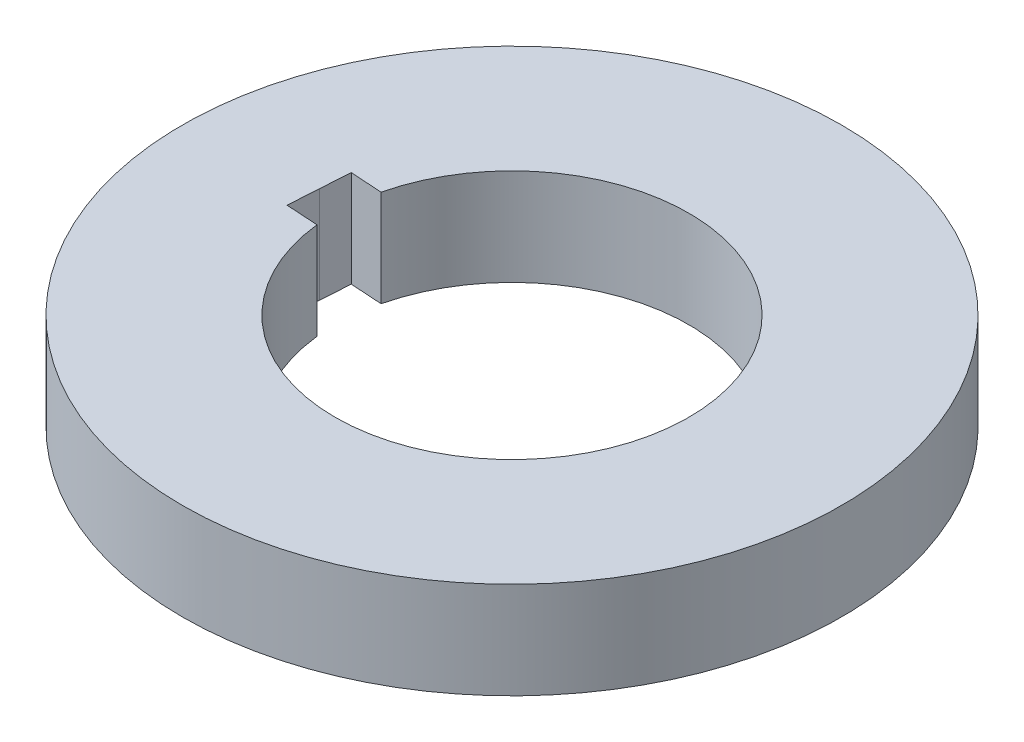
ISO-10303-21;
HEADER;
FILE_DESCRIPTION(('STEP AP214'),'2;1');
FILE_NAME('part.step','',(''),(''),'','','');
FILE_SCHEMA(('AUTOMOTIVE_DESIGN { 1 0 10303 214 1 1 1 1 }'));
ENDSEC;
DATA;
#1=APPLICATION_CONTEXT('core data for automotive mechanical design processes');
#2=APPLICATION_PROTOCOL_DEFINITION('international standard','automotive_design',2000,#1);
#3=PRODUCT_CONTEXT('',#1,'mechanical');
#4=PRODUCT('Part','Part','',(#3));
#5=PRODUCT_RELATED_PRODUCT_CATEGORY('part','',(#4));
#6=PRODUCT_DEFINITION_FORMATION('','',#4);
#7=PRODUCT_DEFINITION_CONTEXT('part definition',#1,'design');
#8=PRODUCT_DEFINITION('design','',#6,#7);
#9=PRODUCT_DEFINITION_SHAPE('','',#8);
#10=(LENGTH_UNIT() NAMED_UNIT(*) SI_UNIT(.MILLI.,.METRE.));
#11=(NAMED_UNIT(*) PLANE_ANGLE_UNIT() SI_UNIT($,.RADIAN.));
#12=(NAMED_UNIT(*) SI_UNIT($,.STERADIAN.) SOLID_ANGLE_UNIT());
#13=UNCERTAINTY_MEASURE_WITH_UNIT(LENGTH_MEASURE(1.E-05),#10,'distance_accuracy_value','');
#14=(GEOMETRIC_REPRESENTATION_CONTEXT(3) GLOBAL_UNCERTAINTY_ASSIGNED_CONTEXT((#13)) GLOBAL_UNIT_ASSIGNED_CONTEXT((#10,
#11,#12)) REPRESENTATION_CONTEXT('',''));
#15=CARTESIAN_POINT('',(0.,0.,0.));
#16=DIRECTION('',(0.,0.,1.));
#17=DIRECTION('',(1.,0.,0.));
#18=AXIS2_PLACEMENT_3D('',#15,#16,#17);
#19=CARTESIAN_POINT('',(0.,5.,0.));
#20=DIRECTION('',(0.,-1.,0.));
#21=DIRECTION('',(0.,0.,-1.));
#22=AXIS2_PLACEMENT_3D('',#19,#20,#21);
#23=CYLINDRICAL_SURFACE('',#22,17.05);
#24=CARTESIAN_POINT('',(0.,5.,0.));
#25=DIRECTION('',(0.,1.,0.));
#26=DIRECTION('',(0.,0.,1.));
#27=AXIS2_PLACEMENT_3D('',#24,#25,#26);
#28=CIRCLE('',#27,17.05);
#29=CARTESIAN_POINT('',(0.,5.,17.05));
#30=VERTEX_POINT('',#29);
#31=EDGE_CURVE('E11',#30,#30,#28,.T.);
#32=ORIENTED_EDGE('',*,*,#31,.F.);
#33=EDGE_LOOP('',(#32));
#34=FACE_BOUND('',#33,.T.);
#35=CARTESIAN_POINT('',(0.,0.,0.));
#36=DIRECTION('',(0.,1.,0.));
#37=DIRECTION('',(0.,0.,1.));
#38=AXIS2_PLACEMENT_3D('',#35,#36,#37);
#39=CIRCLE('',#38,17.05);
#40=CARTESIAN_POINT('',(0.,0.,17.05));
#41=VERTEX_POINT('',#40);
#42=EDGE_CURVE('E45',#41,#41,#39,.T.);
#43=ORIENTED_EDGE('',*,*,#42,.T.);
#44=EDGE_LOOP('',(#43));
#45=FACE_BOUND('',#44,.T.);
#46=ADVANCED_FACE('F42',(#34,#45),#23,.T.);
#47=CARTESIAN_POINT('',(0.,5.,0.));
#48=DIRECTION('',(0.,1.,0.));
#49=DIRECTION('',(0.,0.,1.));
#50=AXIS2_PLACEMENT_3D('',#47,#48,#49);
#51=PLANE('',#50);
#52=DIRECTION('',(-0.997935942740257,0.,-0.0642172421325776));
#53=VECTOR('',#52,1.);
#54=CARTESIAN_POINT('',(-10.548439783733,5.,-2.23199868480201));
#55=LINE('',#54,#53);
#56=CARTESIAN_POINT('',(-8.89961035525185,5.,-2.12589640497697));
#57=VERTEX_POINT('',#56);
#58=CARTESIAN_POINT('',(-10.548439783733,5.,-2.23199868480201));
#59=VERTEX_POINT('',#58);
#60=EDGE_CURVE('E129',#57,#59,#55,.T.);
#61=ORIENTED_EDGE('',*,*,#60,.F.);
#62=CARTESIAN_POINT('',(0.,5.,0.));
#63=DIRECTION('',(0.,1.,0.));
#64=DIRECTION('',(0.,0.,1.));
#65=AXIS2_PLACEMENT_3D('',#62,#63,#64);
#66=CIRCLE('',#65,9.15);
#67=CARTESIAN_POINT('',(-9.09587356863715,5.,0.993772621562903));
#68=VERTEX_POINT('',#67);
#69=EDGE_CURVE('E111',#68,#57,#66,.T.);
#70=ORIENTED_EDGE('',*,*,#69,.F.);
#71=DIRECTION('',(0.998026923397017,0.,0.0627874205130647));
#72=VECTOR('',#71,1.);
#73=CARTESIAN_POINT('',(-10.7470679499657,5.,0.889893423979336));
#74=LINE('',#73,#72);
#75=CARTESIAN_POINT('',(-10.7470679499657,5.,0.889893423979336));
#76=VERTEX_POINT('',#75);
#77=EDGE_CURVE('E56',#76,#68,#74,.T.);
#78=ORIENTED_EDGE('',*,*,#77,.F.);
#79=DIRECTION('',(-0.0627874205130644,0.,0.998026923397017));
#80=VECTOR('',#79,1.);
#81=CARTESIAN_POINT('',(-10.6479765090385,5.,-0.685197973554616));
#82=LINE('',#81,#80);
#83=CARTESIAN_POINT('',(-10.6479765090385,5.,-0.685197973554616));
#84=VERTEX_POINT('',#83);
#85=EDGE_CURVE('E132',#84,#76,#82,.T.);
#86=ORIENTED_EDGE('',*,*,#85,.F.);
#87=DIRECTION('',(-0.0642172421325776,0.,0.997935942740257));
#88=VECTOR('',#87,1.);
#89=CARTESIAN_POINT('',(-10.6479765090385,5.,-0.685197973554616));
#90=LINE('',#89,#88);
#91=EDGE_CURVE('E126',#59,#84,#90,.T.);
#92=ORIENTED_EDGE('',*,*,#91,.F.);
#93=EDGE_LOOP('',(#61,#70,#78,#86,#92));
#94=FACE_BOUND('',#93,.T.);
#95=ORIENTED_EDGE('',*,*,#31,.T.);
#96=EDGE_LOOP('',(#95));
#97=FACE_BOUND('',#96,.T.);
#98=ADVANCED_FACE('F149',(#94,#97),#51,.T.);
#99=CARTESIAN_POINT('',(0.,0.,0.));
#100=DIRECTION('',(0.,1.,0.));
#101=DIRECTION('',(0.,0.,1.));
#102=AXIS2_PLACEMENT_3D('',#99,#100,#101);
#103=PLANE('',#102);
#104=CARTESIAN_POINT('',(0.,0.,0.));
#105=DIRECTION('',(0.,1.,0.));
#106=DIRECTION('',(0.,0.,1.));
#107=AXIS2_PLACEMENT_3D('',#104,#105,#106);
#108=CIRCLE('',#107,9.15);
#109=CARTESIAN_POINT('',(-9.09587356863715,0.,0.993772621562908));
#110=VERTEX_POINT('',#109);
#111=CARTESIAN_POINT('',(-8.89961035525185,0.,-2.12589640497697));
#112=VERTEX_POINT('',#111);
#113=EDGE_CURVE('E109',#110,#112,#108,.T.);
#114=ORIENTED_EDGE('',*,*,#113,.T.);
#115=DIRECTION('',(-0.997935942740257,0.,-0.0642172421325776));
#116=VECTOR('',#115,1.);
#117=CARTESIAN_POINT('',(-10.548439783733,0.,-2.23199868480201));
#118=LINE('',#117,#116);
#119=CARTESIAN_POINT('',(-10.548439783733,0.,-2.23199868480201));
#120=VERTEX_POINT('',#119);
#121=EDGE_CURVE('E92',#112,#120,#118,.T.);
#122=ORIENTED_EDGE('',*,*,#121,.T.);
#123=DIRECTION('',(-0.0642172421325776,0.,0.997935942740257));
#124=VECTOR('',#123,1.);
#125=CARTESIAN_POINT('',(-10.6479765090385,0.,-0.685197973554616));
#126=LINE('',#125,#124);
#127=CARTESIAN_POINT('',(-10.6479765090385,0.,-0.685197973554616));
#128=VERTEX_POINT('',#127);
#129=EDGE_CURVE('E102',#120,#128,#126,.T.);
#130=ORIENTED_EDGE('',*,*,#129,.T.);
#131=DIRECTION('',(-0.0627874205130644,0.,0.998026923397017));
#132=VECTOR('',#131,1.);
#133=CARTESIAN_POINT('',(-10.6479765090385,0.,-0.685197973554616));
#134=LINE('',#133,#132);
#135=CARTESIAN_POINT('',(-10.7470679499657,0.,0.889893423979336));
#136=VERTEX_POINT('',#135);
#137=EDGE_CURVE('E128',#128,#136,#134,.T.);
#138=ORIENTED_EDGE('',*,*,#137,.T.);
#139=DIRECTION('',(0.998026923397017,0.,0.0627874205130647));
#140=VECTOR('',#139,1.);
#141=CARTESIAN_POINT('',(-10.7470679499657,0.,0.889893423979336));
#142=LINE('',#141,#140);
#143=EDGE_CURVE('E103',#136,#110,#142,.T.);
#144=ORIENTED_EDGE('',*,*,#143,.T.);
#145=EDGE_LOOP('',(#114,#122,#130,#138,#144));
#146=FACE_BOUND('',#145,.T.);
#147=ORIENTED_EDGE('',*,*,#42,.F.);
#148=EDGE_LOOP('',(#147));
#149=FACE_BOUND('',#148,.T.);
#150=ADVANCED_FACE('F115',(#146,#149),#103,.F.);
#151=CARTESIAN_POINT('',(0.,0.,0.));
#152=DIRECTION('',(0.,1.,0.));
#153=DIRECTION('',(0.,0.,1.));
#154=AXIS2_PLACEMENT_3D('',#151,#152,#153);
#155=CYLINDRICAL_SURFACE('',#154,9.15);
#156=ORIENTED_EDGE('',*,*,#69,.T.);
#157=DIRECTION('',(0.,1.,0.));
#158=VECTOR('',#157,1.);
#159=CARTESIAN_POINT('',(-8.89961035525185,0.,-2.12589640497697));
#160=LINE('',#159,#158);
#161=EDGE_CURVE('E96',#112,#57,#160,.T.);
#162=ORIENTED_EDGE('',*,*,#161,.F.);
#163=ORIENTED_EDGE('',*,*,#113,.F.);
#164=DIRECTION('',(0.,1.,0.));
#165=VECTOR('',#164,1.);
#166=CARTESIAN_POINT('',(-9.09587356863715,0.,0.993772621562908));
#167=LINE('',#166,#165);
#168=EDGE_CURVE('E112',#110,#68,#167,.T.);
#169=ORIENTED_EDGE('',*,*,#168,.T.);
#170=EDGE_LOOP('',(#156,#162,#163,#169));
#171=FACE_BOUND('',#170,.T.);
#172=ADVANCED_FACE('F108',(#171),#155,.F.);
#173=CARTESIAN_POINT('',(-10.6479765090385,0.,-0.685197973554616));
#174=DIRECTION('',(-0.998026923397017,0.,-0.0627874205130644));
#175=DIRECTION('',(-0.0627874205130644,0.,0.998026923397017));
#176=AXIS2_PLACEMENT_3D('',#173,#174,#175);
#177=PLANE('',#176);
#178=ORIENTED_EDGE('',*,*,#85,.T.);
#179=DIRECTION('',(0.,1.,0.));
#180=VECTOR('',#179,1.);
#181=CARTESIAN_POINT('',(-10.7470679499657,0.,0.889893423979336));
#182=LINE('',#181,#180);
#183=EDGE_CURVE('E86',#136,#76,#182,.T.);
#184=ORIENTED_EDGE('',*,*,#183,.F.);
#185=ORIENTED_EDGE('',*,*,#137,.F.);
#186=DIRECTION('',(0.,1.,0.));
#187=VECTOR('',#186,1.);
#188=CARTESIAN_POINT('',(-10.6479765090385,0.,-0.685197973554616));
#189=LINE('',#188,#187);
#190=EDGE_CURVE('E65',#128,#84,#189,.T.);
#191=ORIENTED_EDGE('',*,*,#190,.T.);
#192=EDGE_LOOP('',(#178,#184,#185,#191));
#193=FACE_BOUND('',#192,.T.);
#194=ADVANCED_FACE('F136',(#193),#177,.F.);
#195=CARTESIAN_POINT('',(-10.6479765090385,0.,-0.685197973554616));
#196=DIRECTION('',(-0.997935942740257,0.,-0.0642172421325776));
#197=DIRECTION('',(-0.0642172421325776,0.,0.997935942740257));
#198=AXIS2_PLACEMENT_3D('',#195,#196,#197);
#199=PLANE('',#198);
#200=ORIENTED_EDGE('',*,*,#91,.T.);
#201=ORIENTED_EDGE('',*,*,#190,.F.);
#202=ORIENTED_EDGE('',*,*,#129,.F.);
#203=DIRECTION('',(0.,1.,0.));
#204=VECTOR('',#203,1.);
#205=CARTESIAN_POINT('',(-10.548439783733,0.,-2.23199868480201));
#206=LINE('',#205,#204);
#207=EDGE_CURVE('E98',#120,#59,#206,.T.);
#208=ORIENTED_EDGE('',*,*,#207,.T.);
#209=EDGE_LOOP('',(#200,#201,#202,#208));
#210=FACE_BOUND('',#209,.T.);
#211=ADVANCED_FACE('F139',(#210),#199,.F.);
#212=CARTESIAN_POINT('',(-10.548439783733,0.,-2.23199868480201));
#213=DIRECTION('',(0.0642172421325776,0.,-0.997935942740257));
#214=DIRECTION('',(-0.997935942740257,0.,-0.0642172421325776));
#215=AXIS2_PLACEMENT_3D('',#212,#213,#214);
#216=PLANE('',#215);
#217=ORIENTED_EDGE('',*,*,#60,.T.);
#218=ORIENTED_EDGE('',*,*,#207,.F.);
#219=ORIENTED_EDGE('',*,*,#121,.F.);
#220=ORIENTED_EDGE('',*,*,#161,.T.);
#221=EDGE_LOOP('',(#217,#218,#219,#220));
#222=FACE_BOUND('',#221,.T.);
#223=ADVANCED_FACE('F95',(#222),#216,.F.);
#224=CARTESIAN_POINT('',(-10.7470679499657,0.,0.889893423979336));
#225=DIRECTION('',(-0.0627874205130647,0.,0.998026923397017));
#226=DIRECTION('',(0.998026923397017,0.,0.0627874205130647));
#227=AXIS2_PLACEMENT_3D('',#224,#225,#226);
#228=PLANE('',#227);
#229=ORIENTED_EDGE('',*,*,#77,.T.);
#230=ORIENTED_EDGE('',*,*,#168,.F.);
#231=ORIENTED_EDGE('',*,*,#143,.F.);
#232=ORIENTED_EDGE('',*,*,#183,.T.);
#233=EDGE_LOOP('',(#229,#230,#231,#232));
#234=FACE_BOUND('',#233,.T.);
#235=ADVANCED_FACE('F187',(#234),#228,.F.);
#236=CLOSED_SHELL('',(#46,#98,#150,#172,#194,#211,#223,#235));
#237=MANIFOLD_SOLID_BREP('B2',#236);
#238=ADVANCED_BREP_SHAPE_REPRESENTATION('',(#18,#237),#14);
#239=SHAPE_DEFINITION_REPRESENTATION(#9,#238);
ENDSEC;
END-ISO-10303-21;
